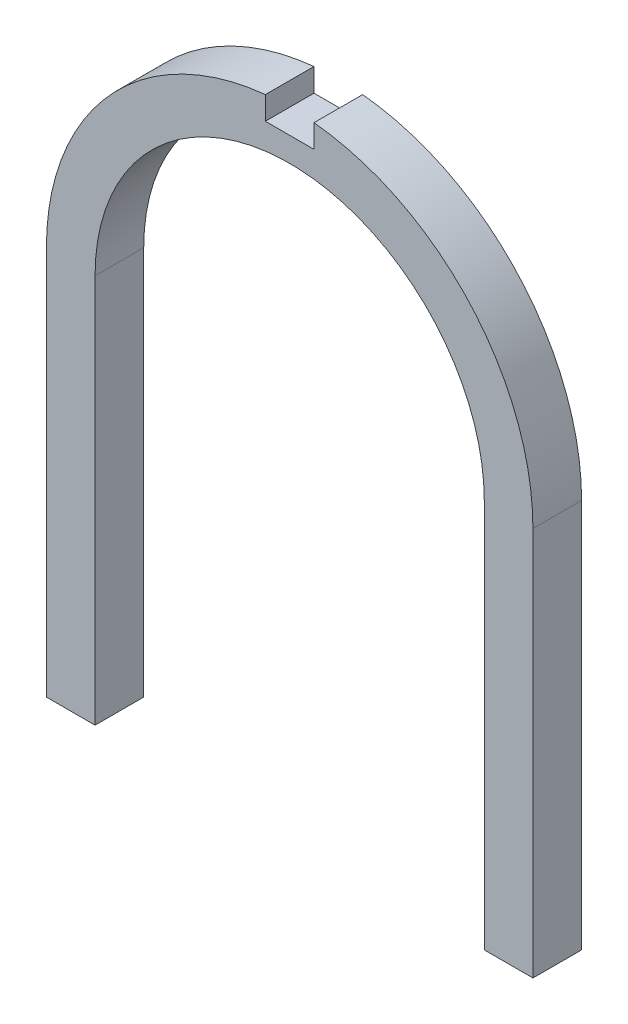
ISO-10303-21;
HEADER;
FILE_DESCRIPTION(('STEP AP214'),'2;1');
FILE_NAME('part.step','',(''),(''),'','','');
FILE_SCHEMA(('AUTOMOTIVE_DESIGN { 1 0 10303 214 1 1 1 1 }'));
ENDSEC;
DATA;
#1=APPLICATION_CONTEXT('core data for automotive mechanical design processes');
#2=APPLICATION_PROTOCOL_DEFINITION('international standard','automotive_design',2000,#1);
#3=PRODUCT_CONTEXT('',#1,'mechanical');
#4=PRODUCT('Part','Part','',(#3));
#5=PRODUCT_RELATED_PRODUCT_CATEGORY('part','',(#4));
#6=PRODUCT_DEFINITION_FORMATION('','',#4);
#7=PRODUCT_DEFINITION_CONTEXT('part definition',#1,'design');
#8=PRODUCT_DEFINITION('design','',#6,#7);
#9=PRODUCT_DEFINITION_SHAPE('','',#8);
#10=(LENGTH_UNIT() NAMED_UNIT(*) SI_UNIT(.MILLI.,.METRE.));
#11=(NAMED_UNIT(*) PLANE_ANGLE_UNIT() SI_UNIT($,.RADIAN.));
#12=(NAMED_UNIT(*) SI_UNIT($,.STERADIAN.) SOLID_ANGLE_UNIT());
#13=UNCERTAINTY_MEASURE_WITH_UNIT(LENGTH_MEASURE(1.E-05),#10,'distance_accuracy_value','');
#14=(GEOMETRIC_REPRESENTATION_CONTEXT(3) GLOBAL_UNCERTAINTY_ASSIGNED_CONTEXT((#13)) GLOBAL_UNIT_ASSIGNED_CONTEXT((#10,
#11,#12)) REPRESENTATION_CONTEXT('',''));
#15=CARTESIAN_POINT('',(0.,0.,0.));
#16=DIRECTION('',(0.,0.,1.));
#17=DIRECTION('',(1.,0.,0.));
#18=AXIS2_PLACEMENT_3D('',#15,#16,#17);
#19=CARTESIAN_POINT('',(-10.5207577272028,7.11533907427342,5.00000000000023));
#20=DIRECTION('',(0.,0.,-1.));
#21=DIRECTION('',(-1.,0.,0.));
#22=AXIS2_PLACEMENT_3D('',#19,#20,#21);
#23=CYLINDRICAL_SURFACE('',#22,25.);
#24=CARTESIAN_POINT('',(-10.5207577272028,7.11533907427342,5.00000000000023));
#25=DIRECTION('',(0.,0.,1.));
#26=DIRECTION('',(1.,0.,0.));
#27=AXIS2_PLACEMENT_3D('',#24,#25,#26);
#28=CIRCLE('',#27,25.);
#29=CARTESIAN_POINT('',(-13.0207577272028,31.9900250019389,5.00000000000023));
#30=VERTEX_POINT('',#29);
#31=CARTESIAN_POINT('',(-35.5207577272029,7.11533907427342,5.00000000000023));
#32=VERTEX_POINT('',#31);
#33=EDGE_CURVE('E127',#30,#32,#28,.T.);
#34=ORIENTED_EDGE('',*,*,#33,.F.);
#35=DIRECTION('',(0.,0.,-1.));
#36=VECTOR('',#35,1.);
#37=CARTESIAN_POINT('',(-13.0207577272028,31.9900250019389,5.00000000000023));
#38=LINE('',#37,#36);
#39=CARTESIAN_POINT('',(-13.0207577272028,31.9900250019389,2.29850860566927E-13));
#40=VERTEX_POINT('',#39);
#41=EDGE_CURVE('E152',#30,#40,#38,.T.);
#42=ORIENTED_EDGE('',*,*,#41,.T.);
#43=CARTESIAN_POINT('',(-10.5207577272028,7.11533907427342,2.29632359912717E-13));
#44=DIRECTION('',(0.,0.,1.));
#45=DIRECTION('',(1.,0.,0.));
#46=AXIS2_PLACEMENT_3D('',#43,#44,#45);
#47=CIRCLE('',#46,25.);
#48=CARTESIAN_POINT('',(-35.5207577272029,7.11533907427342,2.29632359912717E-13));
#49=VERTEX_POINT('',#48);
#50=EDGE_CURVE('E161',#40,#49,#47,.T.);
#51=ORIENTED_EDGE('',*,*,#50,.T.);
#52=DIRECTION('',(0.,0.,-1.));
#53=VECTOR('',#52,1.);
#54=CARTESIAN_POINT('',(-35.5207577272029,7.11533907427342,5.00000000000023));
#55=LINE('',#54,#53);
#56=EDGE_CURVE('E138',#32,#49,#55,.T.);
#57=ORIENTED_EDGE('',*,*,#56,.F.);
#58=EDGE_LOOP('',(#34,#42,#51,#57));
#59=FACE_BOUND('',#58,.T.);
#60=ADVANCED_FACE('F32',(#59),#23,.T.);
#61=CARTESIAN_POINT('',(-30.5207577272028,-32.8846609257266,5.00000000000023));
#62=DIRECTION('',(0.,1.,0.));
#63=DIRECTION('',(-1.,0.,0.));
#64=AXIS2_PLACEMENT_3D('',#61,#62,#63);
#65=PLANE('',#64);
#66=DIRECTION('',(1.,0.,0.));
#67=VECTOR('',#66,1.);
#68=CARTESIAN_POINT('',(-30.5207577272028,-32.8846609257266,2.29632359912717E-13));
#69=LINE('',#68,#67);
#70=CARTESIAN_POINT('',(-35.5207577272029,-32.8846609257266,2.29632359912717E-13));
#71=VERTEX_POINT('',#70);
#72=CARTESIAN_POINT('',(-30.5207577272028,-32.8846609257266,2.29632359912717E-13));
#73=VERTEX_POINT('',#72);
#74=EDGE_CURVE('E148',#71,#73,#69,.T.);
#75=ORIENTED_EDGE('',*,*,#74,.T.);
#76=DIRECTION('',(0.,0.,-1.));
#77=VECTOR('',#76,1.);
#78=CARTESIAN_POINT('',(-30.5207577272028,-32.8846609257266,5.00000000000023));
#79=LINE('',#78,#77);
#80=CARTESIAN_POINT('',(-30.5207577272028,-32.8846609257266,5.00000000000023));
#81=VERTEX_POINT('',#80);
#82=EDGE_CURVE('E40',#81,#73,#79,.T.);
#83=ORIENTED_EDGE('',*,*,#82,.F.);
#84=DIRECTION('',(1.,0.,0.));
#85=VECTOR('',#84,1.);
#86=CARTESIAN_POINT('',(-30.5207577272028,-32.8846609257266,5.00000000000023));
#87=LINE('',#86,#85);
#88=CARTESIAN_POINT('',(-35.5207577272029,-32.8846609257266,5.00000000000023));
#89=VERTEX_POINT('',#88);
#90=EDGE_CURVE('E165',#89,#81,#87,.T.);
#91=ORIENTED_EDGE('',*,*,#90,.F.);
#92=DIRECTION('',(0.,0.,-1.));
#93=VECTOR('',#92,1.);
#94=CARTESIAN_POINT('',(-35.5207577272029,-32.8846609257266,5.00000000000023));
#95=LINE('',#94,#93);
#96=EDGE_CURVE('E144',#89,#71,#95,.T.);
#97=ORIENTED_EDGE('',*,*,#96,.T.);
#98=EDGE_LOOP('',(#75,#83,#91,#97));
#99=FACE_BOUND('',#98,.T.);
#100=ADVANCED_FACE('F34',(#99),#65,.F.);
#101=CARTESIAN_POINT('',(-30.5207577272028,-32.8846609257266,5.00000000000023));
#102=DIRECTION('',(-1.,0.,0.));
#103=DIRECTION('',(0.,-1.,0.));
#104=AXIS2_PLACEMENT_3D('',#101,#102,#103);
#105=PLANE('',#104);
#106=DIRECTION('',(0.,1.,0.));
#107=VECTOR('',#106,1.);
#108=CARTESIAN_POINT('',(-30.5207577272028,-32.8846609257266,2.29632359912717E-13));
#109=LINE('',#108,#107);
#110=CARTESIAN_POINT('',(-30.5207577272028,7.11533907427342,2.29632359912717E-13));
#111=VERTEX_POINT('',#110);
#112=EDGE_CURVE('E151',#73,#111,#109,.T.);
#113=ORIENTED_EDGE('',*,*,#112,.T.);
#114=DIRECTION('',(0.,0.,-1.));
#115=VECTOR('',#114,1.);
#116=CARTESIAN_POINT('',(-30.5207577272028,7.11533907427342,5.00000000000023));
#117=LINE('',#116,#115);
#118=CARTESIAN_POINT('',(-30.5207577272028,7.11533907427342,5.00000000000023));
#119=VERTEX_POINT('',#118);
#120=EDGE_CURVE('E175',#119,#111,#117,.T.);
#121=ORIENTED_EDGE('',*,*,#120,.F.);
#122=DIRECTION('',(0.,1.,0.));
#123=VECTOR('',#122,1.);
#124=CARTESIAN_POINT('',(-30.5207577272028,-32.8846609257266,5.00000000000023));
#125=LINE('',#124,#123);
#126=EDGE_CURVE('E98',#81,#119,#125,.T.);
#127=ORIENTED_EDGE('',*,*,#126,.F.);
#128=ORIENTED_EDGE('',*,*,#82,.T.);
#129=EDGE_LOOP('',(#113,#121,#127,#128));
#130=FACE_BOUND('',#129,.T.);
#131=ADVANCED_FACE('F178',(#130),#105,.F.);
#132=CARTESIAN_POINT('',(-10.5207577272028,7.11533907427342,5.00000000000023));
#133=DIRECTION('',(0.,0.,-1.));
#134=DIRECTION('',(-1.,0.,0.));
#135=AXIS2_PLACEMENT_3D('',#132,#133,#134);
#136=CYLINDRICAL_SURFACE('',#135,20.);
#137=CARTESIAN_POINT('',(-10.5207577272028,7.11533907427342,2.29632359912717E-13));
#138=DIRECTION('',(0.,0.,-1.));
#139=DIRECTION('',(-1.,0.,0.));
#140=AXIS2_PLACEMENT_3D('',#137,#138,#139);
#141=CIRCLE('',#140,20.);
#142=CARTESIAN_POINT('',(9.47924227279715,7.11533907427342,2.29632359912717E-13));
#143=VERTEX_POINT('',#142);
#144=EDGE_CURVE('E154',#111,#143,#141,.T.);
#145=ORIENTED_EDGE('',*,*,#144,.T.);
#146=DIRECTION('',(0.,0.,-1.));
#147=VECTOR('',#146,1.);
#148=CARTESIAN_POINT('',(9.47924227279715,7.11533907427342,5.00000000000023));
#149=LINE('',#148,#147);
#150=CARTESIAN_POINT('',(9.47924227279715,7.11533907427342,5.00000000000023));
#151=VERTEX_POINT('',#150);
#152=EDGE_CURVE('E172',#151,#143,#149,.T.);
#153=ORIENTED_EDGE('',*,*,#152,.F.);
#154=CARTESIAN_POINT('',(-10.5207577272028,7.11533907427342,5.00000000000023));
#155=DIRECTION('',(0.,0.,-1.));
#156=DIRECTION('',(-1.,0.,0.));
#157=AXIS2_PLACEMENT_3D('',#154,#155,#156);
#158=CIRCLE('',#157,20.);
#159=EDGE_CURVE('E197',#119,#151,#158,.T.);
#160=ORIENTED_EDGE('',*,*,#159,.F.);
#161=ORIENTED_EDGE('',*,*,#120,.T.);
#162=EDGE_LOOP('',(#145,#153,#160,#161));
#163=FACE_BOUND('',#162,.T.);
#164=ADVANCED_FACE('F190',(#163),#136,.F.);
#165=CARTESIAN_POINT('',(9.47924227279716,7.11533907427342,5.00000000000023));
#166=DIRECTION('',(1.,0.,0.));
#167=DIRECTION('',(0.,1.,0.));
#168=AXIS2_PLACEMENT_3D('',#165,#166,#167);
#169=PLANE('',#168);
#170=DIRECTION('',(0.,-1.,0.));
#171=VECTOR('',#170,1.);
#172=CARTESIAN_POINT('',(9.47924227279716,7.11533907427342,2.29632359912717E-13));
#173=LINE('',#172,#171);
#174=CARTESIAN_POINT('',(9.47924227279715,-32.8846609257266,2.29632359912717E-13));
#175=VERTEX_POINT('',#174);
#176=EDGE_CURVE('E156',#143,#175,#173,.T.);
#177=ORIENTED_EDGE('',*,*,#176,.T.);
#178=DIRECTION('',(0.,0.,-1.));
#179=VECTOR('',#178,1.);
#180=CARTESIAN_POINT('',(9.47924227279715,-32.8846609257266,5.00000000000023));
#181=LINE('',#180,#179);
#182=CARTESIAN_POINT('',(9.47924227279715,-32.8846609257266,5.00000000000023));
#183=VERTEX_POINT('',#182);
#184=EDGE_CURVE('E169',#183,#175,#181,.T.);
#185=ORIENTED_EDGE('',*,*,#184,.F.);
#186=DIRECTION('',(0.,-1.,0.));
#187=VECTOR('',#186,1.);
#188=CARTESIAN_POINT('',(9.47924227279716,7.11533907427342,5.00000000000023));
#189=LINE('',#188,#187);
#190=EDGE_CURVE('E196',#151,#183,#189,.T.);
#191=ORIENTED_EDGE('',*,*,#190,.F.);
#192=ORIENTED_EDGE('',*,*,#152,.T.);
#193=EDGE_LOOP('',(#177,#185,#191,#192));
#194=FACE_BOUND('',#193,.T.);
#195=ADVANCED_FACE('F194',(#194),#169,.F.);
#196=CARTESIAN_POINT('',(9.47924227279715,-32.8846609257266,5.00000000000023));
#197=DIRECTION('',(0.,1.,0.));
#198=DIRECTION('',(-1.,0.,0.));
#199=AXIS2_PLACEMENT_3D('',#196,#197,#198);
#200=PLANE('',#199);
#201=DIRECTION('',(1.,0.,0.));
#202=VECTOR('',#201,1.);
#203=CARTESIAN_POINT('',(9.47924227279715,-32.8846609257266,2.29632359912717E-13));
#204=LINE('',#203,#202);
#205=CARTESIAN_POINT('',(14.4792422727972,-32.8846609257266,2.29632359912717E-13));
#206=VERTEX_POINT('',#205);
#207=EDGE_CURVE('E158',#175,#206,#204,.T.);
#208=ORIENTED_EDGE('',*,*,#207,.T.);
#209=DIRECTION('',(0.,0.,-1.));
#210=VECTOR('',#209,1.);
#211=CARTESIAN_POINT('',(14.4792422727972,-32.8846609257266,5.00000000000023));
#212=LINE('',#211,#210);
#213=CARTESIAN_POINT('',(14.4792422727972,-32.8846609257266,5.00000000000023));
#214=VERTEX_POINT('',#213);
#215=EDGE_CURVE('E137',#214,#206,#212,.T.);
#216=ORIENTED_EDGE('',*,*,#215,.F.);
#217=DIRECTION('',(1.,0.,0.));
#218=VECTOR('',#217,1.);
#219=CARTESIAN_POINT('',(9.47924227279715,-32.8846609257266,5.00000000000023));
#220=LINE('',#219,#218);
#221=EDGE_CURVE('E123',#183,#214,#220,.T.);
#222=ORIENTED_EDGE('',*,*,#221,.F.);
#223=ORIENTED_EDGE('',*,*,#184,.T.);
#224=EDGE_LOOP('',(#208,#216,#222,#223));
#225=FACE_BOUND('',#224,.T.);
#226=ADVANCED_FACE('F267',(#225),#200,.F.);
#227=CARTESIAN_POINT('',(14.4792422727972,-32.8846609257266,5.00000000000023));
#228=DIRECTION('',(-1.,0.,0.));
#229=DIRECTION('',(0.,0.,1.));
#230=AXIS2_PLACEMENT_3D('',#227,#228,#229);
#231=PLANE('',#230);
#232=DIRECTION('',(0.,1.,0.));
#233=VECTOR('',#232,1.);
#234=CARTESIAN_POINT('',(14.4792422727972,-32.8846609257266,2.29632359912717E-13));
#235=LINE('',#234,#233);
#236=CARTESIAN_POINT('',(14.4792422727972,7.11533907427342,2.29632359912717E-13));
#237=VERTEX_POINT('',#236);
#238=EDGE_CURVE('E133',#206,#237,#235,.T.);
#239=ORIENTED_EDGE('',*,*,#238,.T.);
#240=DIRECTION('',(0.,0.,-1.));
#241=VECTOR('',#240,1.);
#242=CARTESIAN_POINT('',(14.4792422727972,7.11533907427342,5.00000000000023));
#243=LINE('',#242,#241);
#244=CARTESIAN_POINT('',(14.4792422727972,7.11533907427342,5.00000000000023));
#245=VERTEX_POINT('',#244);
#246=EDGE_CURVE('E130',#245,#237,#243,.T.);
#247=ORIENTED_EDGE('',*,*,#246,.F.);
#248=DIRECTION('',(0.,1.,0.));
#249=VECTOR('',#248,1.);
#250=CARTESIAN_POINT('',(14.4792422727972,-32.8846609257266,5.00000000000023));
#251=LINE('',#250,#249);
#252=EDGE_CURVE('E114',#214,#245,#251,.T.);
#253=ORIENTED_EDGE('',*,*,#252,.F.);
#254=ORIENTED_EDGE('',*,*,#215,.T.);
#255=EDGE_LOOP('',(#239,#247,#253,#254));
#256=FACE_BOUND('',#255,.T.);
#257=ADVANCED_FACE('F131',(#256),#231,.F.);
#258=CARTESIAN_POINT('',(-8.02075772720285,31.9900250019389,2.29850860566927E-13));
#259=VERTEX_POINT('',#258);
#260=EDGE_CURVE('E162',#237,#259,#47,.T.);
#261=ORIENTED_EDGE('',*,*,#260,.T.);
#262=DIRECTION('',(0.,0.,-1.));
#263=VECTOR('',#262,1.);
#264=CARTESIAN_POINT('',(-8.02075772720285,31.9900250019389,5.00000000000023));
#265=LINE('',#264,#263);
#266=CARTESIAN_POINT('',(-8.02075772720285,31.9900250019389,5.00000000000023));
#267=VERTEX_POINT('',#266);
#268=EDGE_CURVE('E142',#259,#267,#265,.F.);
#269=ORIENTED_EDGE('',*,*,#268,.T.);
#270=EDGE_CURVE('E121',#245,#267,#28,.T.);
#271=ORIENTED_EDGE('',*,*,#270,.F.);
#272=ORIENTED_EDGE('',*,*,#246,.T.);
#273=EDGE_LOOP('',(#261,#269,#271,#272));
#274=FACE_BOUND('',#273,.T.);
#275=ADVANCED_FACE('F141',(#274),#23,.T.);
#276=CARTESIAN_POINT('',(-35.5207577272029,-32.8846609257266,5.00000000000023));
#277=DIRECTION('',(1.,0.,0.));
#278=DIRECTION('',(0.,0.,-1.));
#279=AXIS2_PLACEMENT_3D('',#276,#277,#278);
#280=PLANE('',#279);
#281=DIRECTION('',(0.,-1.,0.));
#282=VECTOR('',#281,1.);
#283=CARTESIAN_POINT('',(-35.5207577272029,-32.8846609257266,2.29632359912717E-13));
#284=LINE('',#283,#282);
#285=EDGE_CURVE('E89',#49,#71,#284,.T.);
#286=ORIENTED_EDGE('',*,*,#285,.T.);
#287=ORIENTED_EDGE('',*,*,#96,.F.);
#288=DIRECTION('',(0.,-1.,0.));
#289=VECTOR('',#288,1.);
#290=CARTESIAN_POINT('',(-35.5207577272029,-32.8846609257266,5.00000000000023));
#291=LINE('',#290,#289);
#292=EDGE_CURVE('E56',#32,#89,#291,.T.);
#293=ORIENTED_EDGE('',*,*,#292,.F.);
#294=ORIENTED_EDGE('',*,*,#56,.T.);
#295=EDGE_LOOP('',(#286,#287,#293,#294));
#296=FACE_BOUND('',#295,.T.);
#297=ADVANCED_FACE('F262',(#296),#280,.F.);
#298=CARTESIAN_POINT('',(-10.5207577272028,7.11533907427342,5.00000000000023));
#299=DIRECTION('',(0.,0.,1.));
#300=DIRECTION('',(1.,0.,0.));
#301=AXIS2_PLACEMENT_3D('',#298,#299,#300);
#302=PLANE('',#301);
#303=DIRECTION('',(0.,-1.,0.));
#304=VECTOR('',#303,1.);
#305=CARTESIAN_POINT('',(-13.0207577272029,41.0581506000952,5.00000000000023));
#306=LINE('',#305,#304);
#307=CARTESIAN_POINT('',(-13.0207577272028,29.6153390742734,5.00000000000023));
#308=VERTEX_POINT('',#307);
#309=EDGE_CURVE('E218',#30,#308,#306,.T.);
#310=ORIENTED_EDGE('',*,*,#309,.F.);
#311=ORIENTED_EDGE('',*,*,#33,.T.);
#312=ORIENTED_EDGE('',*,*,#292,.T.);
#313=ORIENTED_EDGE('',*,*,#90,.T.);
#314=ORIENTED_EDGE('',*,*,#126,.T.);
#315=ORIENTED_EDGE('',*,*,#159,.T.);
#316=ORIENTED_EDGE('',*,*,#190,.T.);
#317=ORIENTED_EDGE('',*,*,#221,.T.);
#318=ORIENTED_EDGE('',*,*,#252,.T.);
#319=ORIENTED_EDGE('',*,*,#270,.T.);
#320=DIRECTION('',(0.,1.,0.));
#321=VECTOR('',#320,1.);
#322=CARTESIAN_POINT('',(-8.02075772720285,41.0581506000952,5.00000000000023));
#323=LINE('',#322,#321);
#324=CARTESIAN_POINT('',(-8.02075772720285,29.6153390742734,5.00000000000023));
#325=VERTEX_POINT('',#324);
#326=EDGE_CURVE('E211',#325,#267,#323,.T.);
#327=ORIENTED_EDGE('',*,*,#326,.F.);
#328=DIRECTION('',(1.,0.,0.));
#329=VECTOR('',#328,1.);
#330=CARTESIAN_POINT('',(-13.0207577272028,29.6153390742734,5.00000000000023));
#331=LINE('',#330,#329);
#332=EDGE_CURVE('E215',#308,#325,#331,.T.);
#333=ORIENTED_EDGE('',*,*,#332,.F.);
#334=EDGE_LOOP('',(#310,#311,#312,#313,#314,#315,#316,#317,#318,#319,#327,#333));
#335=FACE_BOUND('',#334,.T.);
#336=ADVANCED_FACE('F117',(#335),#302,.T.);
#337=CARTESIAN_POINT('',(-10.5207577272028,7.11533907427342,2.29632359912717E-13));
#338=DIRECTION('',(0.,0.,1.));
#339=DIRECTION('',(1.,0.,0.));
#340=AXIS2_PLACEMENT_3D('',#337,#338,#339);
#341=PLANE('',#340);
#342=ORIENTED_EDGE('',*,*,#50,.F.);
#343=DIRECTION('',(0.,-1.,0.));
#344=VECTOR('',#343,1.);
#345=CARTESIAN_POINT('',(-13.0207577272028,7.11533907427342,2.29632359912717E-13));
#346=LINE('',#345,#344);
#347=CARTESIAN_POINT('',(-13.0207577272028,29.6153390742734,2.29850860566927E-13));
#348=VERTEX_POINT('',#347);
#349=EDGE_CURVE('E11',#40,#348,#346,.T.);
#350=ORIENTED_EDGE('',*,*,#349,.T.);
#351=DIRECTION('',(1.,0.,0.));
#352=VECTOR('',#351,1.);
#353=CARTESIAN_POINT('',(-13.0207577272028,29.6153390742734,2.29850860566927E-13));
#354=LINE('',#353,#352);
#355=CARTESIAN_POINT('',(-8.02075772720285,29.6153390742734,2.29632359912717E-13));
#356=VERTEX_POINT('',#355);
#357=EDGE_CURVE('E214',#348,#356,#354,.T.);
#358=ORIENTED_EDGE('',*,*,#357,.T.);
#359=DIRECTION('',(0.,1.,0.));
#360=VECTOR('',#359,1.);
#361=CARTESIAN_POINT('',(-8.02075772720285,41.0581506000952,2.29850860566927E-13));
#362=LINE('',#361,#360);
#363=EDGE_CURVE('E47',#356,#259,#362,.T.);
#364=ORIENTED_EDGE('',*,*,#363,.T.);
#365=ORIENTED_EDGE('',*,*,#260,.F.);
#366=ORIENTED_EDGE('',*,*,#238,.F.);
#367=ORIENTED_EDGE('',*,*,#207,.F.);
#368=ORIENTED_EDGE('',*,*,#176,.F.);
#369=ORIENTED_EDGE('',*,*,#144,.F.);
#370=ORIENTED_EDGE('',*,*,#112,.F.);
#371=ORIENTED_EDGE('',*,*,#74,.F.);
#372=ORIENTED_EDGE('',*,*,#285,.F.);
#373=EDGE_LOOP('',(#342,#350,#358,#364,#365,#366,#367,#368,#369,#370,#371,#372));
#374=FACE_BOUND('',#373,.T.);
#375=ADVANCED_FACE('F184',(#374),#341,.F.);
#376=CARTESIAN_POINT('',(-13.0207577272029,41.0581506000952,2.29850860566927E-13));
#377=DIRECTION('',(-1.,0.,0.));
#378=DIRECTION('',(0.,-1.,0.));
#379=AXIS2_PLACEMENT_3D('',#376,#377,#378);
#380=PLANE('',#379);
#381=ORIENTED_EDGE('',*,*,#309,.T.);
#382=DIRECTION('',(0.,0.,1.));
#383=VECTOR('',#382,1.);
#384=CARTESIAN_POINT('',(-13.0207577272028,29.6153390742734,2.29850860566927E-13));
#385=LINE('',#384,#383);
#386=EDGE_CURVE('E207',#348,#308,#385,.T.);
#387=ORIENTED_EDGE('',*,*,#386,.F.);
#388=ORIENTED_EDGE('',*,*,#349,.F.);
#389=ORIENTED_EDGE('',*,*,#41,.F.);
#390=EDGE_LOOP('',(#381,#387,#388,#389));
#391=FACE_BOUND('',#390,.T.);
#392=ADVANCED_FACE('F241',(#391),#380,.F.);
#393=CARTESIAN_POINT('',(-8.02075772720285,41.0581506000952,2.29850860566927E-13));
#394=DIRECTION('',(1.,0.,0.));
#395=DIRECTION('',(0.,0.,-1.));
#396=AXIS2_PLACEMENT_3D('',#393,#394,#395);
#397=PLANE('',#396);
#398=ORIENTED_EDGE('',*,*,#363,.F.);
#399=DIRECTION('',(0.,0.,1.));
#400=VECTOR('',#399,1.);
#401=CARTESIAN_POINT('',(-8.02075772720285,29.6153390742734,2.29850860566927E-13));
#402=LINE('',#401,#400);
#403=EDGE_CURVE('E206',#356,#325,#402,.T.);
#404=ORIENTED_EDGE('',*,*,#403,.T.);
#405=ORIENTED_EDGE('',*,*,#326,.T.);
#406=ORIENTED_EDGE('',*,*,#268,.F.);
#407=EDGE_LOOP('',(#398,#404,#405,#406));
#408=FACE_BOUND('',#407,.T.);
#409=ADVANCED_FACE('F245',(#408),#397,.F.);
#410=CARTESIAN_POINT('',(-13.0207577272028,29.6153390742734,2.29850860566927E-13));
#411=DIRECTION('',(0.,-1.,0.));
#412=DIRECTION('',(0.,0.,-1.));
#413=AXIS2_PLACEMENT_3D('',#410,#411,#412);
#414=PLANE('',#413);
#415=ORIENTED_EDGE('',*,*,#332,.T.);
#416=ORIENTED_EDGE('',*,*,#403,.F.);
#417=ORIENTED_EDGE('',*,*,#357,.F.);
#418=ORIENTED_EDGE('',*,*,#386,.T.);
#419=EDGE_LOOP('',(#415,#416,#417,#418));
#420=FACE_BOUND('',#419,.T.);
#421=ADVANCED_FACE('F228',(#420),#414,.F.);
#422=CLOSED_SHELL('',(#60,#100,#131,#164,#195,#226,#257,#275,#297,#336,#375,#392,#409,#421));
#423=MANIFOLD_SOLID_BREP('B2',#422);
#424=ADVANCED_BREP_SHAPE_REPRESENTATION('',(#18,#423),#14);
#425=SHAPE_DEFINITION_REPRESENTATION(#9,#424);
ENDSEC;
END-ISO-10303-21;
